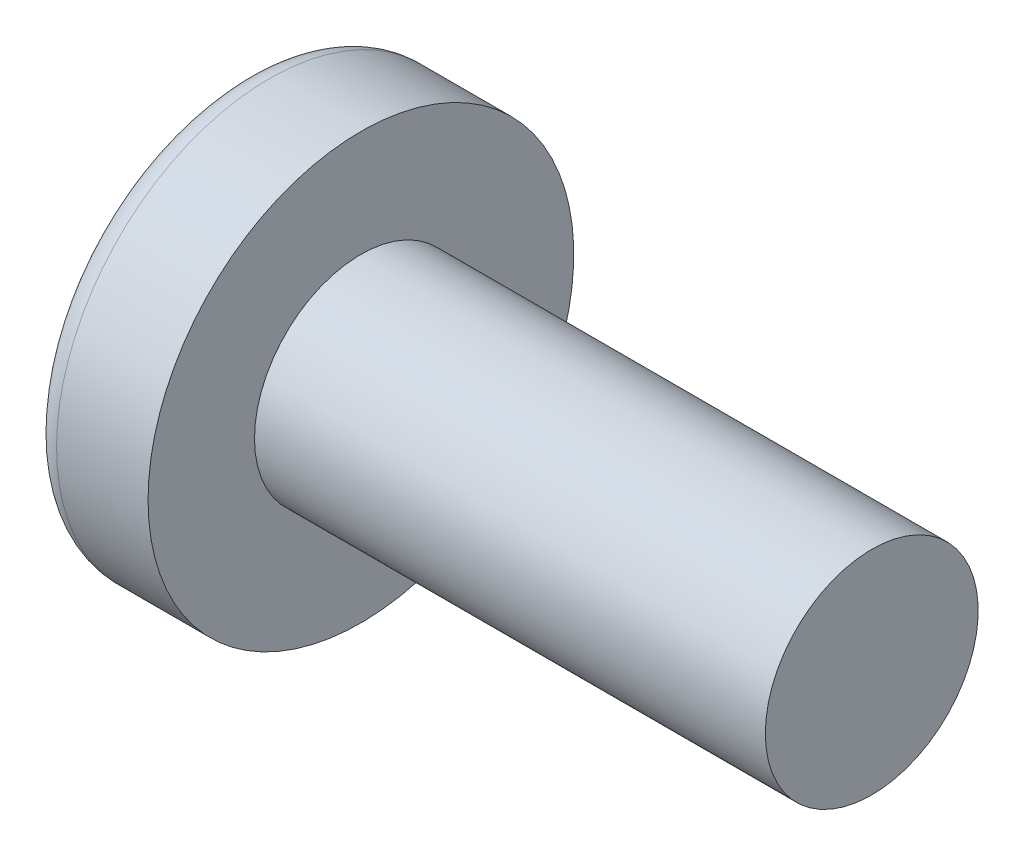
ISO-10303-21;
HEADER;
FILE_DESCRIPTION(('STEP AP214'),'2;1');
FILE_NAME('part.step','',(''),(''),'','','');
FILE_SCHEMA(('AUTOMOTIVE_DESIGN { 1 0 10303 214 1 1 1 1 }'));
ENDSEC;
DATA;
#1=APPLICATION_CONTEXT('core data for automotive mechanical design processes');
#2=APPLICATION_PROTOCOL_DEFINITION('international standard','automotive_design',2000,#1);
#3=PRODUCT_CONTEXT('',#1,'mechanical');
#4=PRODUCT('Part','Part','',(#3));
#5=PRODUCT_RELATED_PRODUCT_CATEGORY('part','',(#4));
#6=PRODUCT_DEFINITION_FORMATION('','',#4);
#7=PRODUCT_DEFINITION_CONTEXT('part definition',#1,'design');
#8=PRODUCT_DEFINITION('design','',#6,#7);
#9=PRODUCT_DEFINITION_SHAPE('','',#8);
#10=(LENGTH_UNIT() NAMED_UNIT(*) SI_UNIT(.MILLI.,.METRE.));
#11=(NAMED_UNIT(*) PLANE_ANGLE_UNIT() SI_UNIT($,.RADIAN.));
#12=(NAMED_UNIT(*) SI_UNIT($,.STERADIAN.) SOLID_ANGLE_UNIT());
#13=UNCERTAINTY_MEASURE_WITH_UNIT(LENGTH_MEASURE(1.E-05),#10,'distance_accuracy_value','');
#14=(GEOMETRIC_REPRESENTATION_CONTEXT(3) GLOBAL_UNCERTAINTY_ASSIGNED_CONTEXT((#13)) GLOBAL_UNIT_ASSIGNED_CONTEXT((#10,
#11,#12)) REPRESENTATION_CONTEXT('',''));
#15=CARTESIAN_POINT('',(0.,0.,0.));
#16=DIRECTION('',(0.,0.,1.));
#17=DIRECTION('',(1.,0.,0.));
#18=AXIS2_PLACEMENT_3D('',#15,#16,#17);
#19=CARTESIAN_POINT('',(1.53,0.175,-0.175));
#20=DIRECTION('',(-1.,0.,0.));
#21=DIRECTION('',(0.,0.,1.));
#22=AXIS2_PLACEMENT_3D('',#19,#20,#21);
#23=PLANE('',#22);
#24=DIRECTION('',(0.,1.,0.));
#25=VECTOR('',#24,1.);
#26=CARTESIAN_POINT('',(1.53,-0.175,0.175));
#27=LINE('',#26,#25);
#28=CARTESIAN_POINT('',(1.53000000000001,-0.175000000000024,0.17500000000007));
#29=VERTEX_POINT('',#28);
#30=CARTESIAN_POINT('',(1.53000000000001,0.175000000000047,0.175000000000024));
#31=VERTEX_POINT('',#30);
#32=EDGE_CURVE('E96',#29,#31,#27,.T.);
#33=ORIENTED_EDGE('',*,*,#32,.T.);
#34=DIRECTION('',(0.,0.,1.));
#35=VECTOR('',#34,1.);
#36=CARTESIAN_POINT('',(1.53,0.175,0.175));
#37=LINE('',#36,#35);
#38=CARTESIAN_POINT('',(1.53000000000001,0.175000000000023,-0.175000000000047));
#39=VERTEX_POINT('',#38);
#40=EDGE_CURVE('E179',#31,#39,#37,.F.);
#41=ORIENTED_EDGE('',*,*,#40,.T.);
#42=DIRECTION('',(0.,1.,0.));
#43=VECTOR('',#42,1.);
#44=CARTESIAN_POINT('',(1.53,0.175,-0.175));
#45=LINE('',#44,#43);
#46=CARTESIAN_POINT('',(1.53000000000001,-0.175000000000047,-0.175000000000024));
#47=VERTEX_POINT('',#46);
#48=EDGE_CURVE('E99',#39,#47,#45,.F.);
#49=ORIENTED_EDGE('',*,*,#48,.T.);
#50=DIRECTION('',(0.,0.,1.));
#51=VECTOR('',#50,1.);
#52=CARTESIAN_POINT('',(1.53,-0.175,-0.175));
#53=LINE('',#52,#51);
#54=EDGE_CURVE('E94',#47,#29,#53,.T.);
#55=ORIENTED_EDGE('',*,*,#54,.T.);
#56=EDGE_LOOP('',(#33,#41,#49,#55));
#57=FACE_BOUND('',#56,.T.);
#58=ADVANCED_FACE('F17',(#57),#23,.T.);
#59=CARTESIAN_POINT('',(1.53,0.175,-0.175));
#60=DIRECTION('',(0.605808178465619,0.,-0.795610740817499));
#61=DIRECTION('',(-0.795610740817499,0.,-0.605808178465619));
#62=AXIS2_PLACEMENT_3D('',#59,#60,#61);
#63=PLANE('',#62);
#64=ORIENTED_EDGE('',*,*,#48,.F.);
#65=DIRECTION('',(0.792336746135029,-0.0906267520091843,0.603315234802188));
#66=VECTOR('',#65,1.);
#67=CARTESIAN_POINT('',(0.195539940030044,0.327634320585383,-1.191108477036));
#68=LINE('',#67,#66);
#69=CARTESIAN_POINT('',(0.195539940029982,0.327634320585273,-1.19110847703603));
#70=VERTEX_POINT('',#69);
#71=EDGE_CURVE('E158',#70,#39,#68,.T.);
#72=ORIENTED_EDGE('',*,*,#71,.F.);
#73=CARTESIAN_POINT('',(0.19553994002992,-0.327634320585159,-1.19110847703605));
#74=CARTESIAN_POINT('',(0.18795976832639,-0.218422880390105,-1.19688030712404));
#75=CARTESIAN_POINT('',(0.184169682474625,-0.109211440195052,-1.19976622216803));
#76=CARTESIAN_POINT('',(0.184169682474625,0.109211440195056,-1.19976622216803));
#77=CARTESIAN_POINT('',(0.18795976832639,0.218422880390109,-1.19688030712404));
#78=CARTESIAN_POINT('',(0.195539940029921,0.327634320585163,-1.19110847703605));
#79=B_SPLINE_CURVE_WITH_KNOTS('',3,(#73,#74,#75,#76,#77,#78),.UNSPECIFIED.,.F.,.F.,(4,2,4),(0.,
0.327945860368665,0.65589172073733),.UNSPECIFIED.);
#80=CARTESIAN_POINT('',(0.195539940029981,-0.327634320585267,-1.19110847703603));
#81=VERTEX_POINT('',#80);
#82=EDGE_CURVE('E20',#81,#70,#79,.T.);
#83=ORIENTED_EDGE('',*,*,#82,.F.);
#84=DIRECTION('',(-0.79233674613503,-0.0906267520091801,-0.603315234802189));
#85=VECTOR('',#84,1.);
#86=CARTESIAN_POINT('',(1.53000000000001,-0.175000000000116,-0.175));
#87=LINE('',#86,#85);
#88=EDGE_CURVE('E163',#47,#81,#87,.T.);
#89=ORIENTED_EDGE('',*,*,#88,.F.);
#90=EDGE_LOOP('',(#64,#72,#83,#89));
#91=FACE_BOUND('',#90,.T.);
#92=ADVANCED_FACE('F301',(#91),#63,.F.);
#93=CARTESIAN_POINT('',(1.53,0.175,0.175));
#94=DIRECTION('',(0.605808178465619,0.795610740817499,0.));
#95=DIRECTION('',(-0.795610740817499,0.605808178465619,0.));
#96=AXIS2_PLACEMENT_3D('',#93,#94,#95);
#97=PLANE('',#96);
#98=ORIENTED_EDGE('',*,*,#40,.F.);
#99=DIRECTION('',(0.79233674613503,-0.603315234802189,-0.0906267520091823));
#100=VECTOR('',#99,1.);
#101=CARTESIAN_POINT('',(0.195539940030044,1.191108477036,0.327634320585379));
#102=LINE('',#101,#100);
#103=CARTESIAN_POINT('',(0.195539940029982,1.19110847703603,0.32763432058527));
#104=VERTEX_POINT('',#103);
#105=EDGE_CURVE('E143',#104,#31,#102,.T.);
#106=ORIENTED_EDGE('',*,*,#105,.F.);
#107=CARTESIAN_POINT('',(0.19553994002992,1.19110847703605,-0.327634320585162));
#108=CARTESIAN_POINT('',(0.187959768326372,1.19688030712378,-0.21842288039011));
#109=CARTESIAN_POINT('',(0.184169682474647,1.19976622216774,-0.109211440195056));
#110=CARTESIAN_POINT('',(0.184169682474842,1.19976622216812,0.109211440195063));
#111=CARTESIAN_POINT('',(0.187959768326763,1.19688030712455,0.218422880390129));
#112=CARTESIAN_POINT('',(0.195539940030506,1.1911084770372,0.327634320585196));
#113=B_SPLINE_CURVE_WITH_KNOTS('',3,(#107,#108,#109,#110,#111,#112),.UNSPECIFIED.,.F.,.F.,(4,2,
4),(0.,0.327945860368659,0.655891720737343),.UNSPECIFIED.);
#114=CARTESIAN_POINT('',(0.195539940029982,1.19110847703603,-0.32763432058527));
#115=VERTEX_POINT('',#114);
#116=EDGE_CURVE('E181',#115,#104,#113,.T.);
#117=ORIENTED_EDGE('',*,*,#116,.F.);
#118=DIRECTION('',(-0.79233674613503,0.603315234802189,-0.0906267520091823));
#119=VECTOR('',#118,1.);
#120=CARTESIAN_POINT('',(1.53000000000001,0.175,-0.175000000000117));
#121=LINE('',#120,#119);
#122=EDGE_CURVE('E148',#39,#115,#121,.T.);
#123=ORIENTED_EDGE('',*,*,#122,.F.);
#124=EDGE_LOOP('',(#98,#106,#117,#123));
#125=FACE_BOUND('',#124,.T.);
#126=ADVANCED_FACE('F298',(#125),#97,.F.);
#127=CARTESIAN_POINT('',(1.53,-0.175,0.175));
#128=DIRECTION('',(0.605808178465619,0.,0.795610740817499));
#129=DIRECTION('',(0.795610740817499,0.,-0.605808178465619));
#130=AXIS2_PLACEMENT_3D('',#127,#128,#129);
#131=PLANE('',#130);
#132=ORIENTED_EDGE('',*,*,#32,.F.);
#133=DIRECTION('',(0.792336746135029,0.0906267520091844,-0.603315234802188));
#134=VECTOR('',#133,1.);
#135=CARTESIAN_POINT('',(0.195539940030044,-0.327634320585383,1.191108477036));
#136=LINE('',#135,#134);
#137=CARTESIAN_POINT('',(0.195539940029982,-0.327634320585273,1.19110847703603));
#138=VERTEX_POINT('',#137);
#139=EDGE_CURVE('E107',#138,#29,#136,.T.);
#140=ORIENTED_EDGE('',*,*,#139,.F.);
#141=CARTESIAN_POINT('',(0.19553994002992,0.327634320585159,1.19110847703605));
#142=CARTESIAN_POINT('',(0.18795976832639,0.218422880390106,1.19688030712404));
#143=CARTESIAN_POINT('',(0.184169682474625,0.109211440195052,1.19976622216803));
#144=CARTESIAN_POINT('',(0.184169682474625,-0.109211440195055,1.19976622216803));
#145=CARTESIAN_POINT('',(0.18795976832639,-0.218422880390109,1.19688030712403));
#146=CARTESIAN_POINT('',(0.19553994002992,-0.327634320585162,1.19110847703605));
#147=B_SPLINE_CURVE_WITH_KNOTS('',3,(#141,#142,#143,#144,#145,#146),.UNSPECIFIED.,.F.,.F.,(4,2,
4),(0.,0.327945860368665,0.65589172073733),.UNSPECIFIED.);
#148=CARTESIAN_POINT('',(0.195539940029982,0.327634320585267,1.19110847703603));
#149=VERTEX_POINT('',#148);
#150=EDGE_CURVE('E112',#149,#138,#147,.T.);
#151=ORIENTED_EDGE('',*,*,#150,.F.);
#152=DIRECTION('',(-0.79233674613503,0.0906267520091802,0.603315234802189));
#153=VECTOR('',#152,1.);
#154=CARTESIAN_POINT('',(1.53000000000001,0.175000000000117,0.175));
#155=LINE('',#154,#153);
#156=EDGE_CURVE('E110',#31,#149,#155,.T.);
#157=ORIENTED_EDGE('',*,*,#156,.F.);
#158=EDGE_LOOP('',(#132,#140,#151,#157));
#159=FACE_BOUND('',#158,.T.);
#160=ADVANCED_FACE('F106',(#159),#131,.F.);
#161=CARTESIAN_POINT('',(1.53,-0.175,-0.175));
#162=DIRECTION('',(0.605808178465619,-0.795610740817499,0.));
#163=DIRECTION('',(0.795610740817499,0.605808178465619,0.));
#164=AXIS2_PLACEMENT_3D('',#161,#162,#163);
#165=PLANE('',#164);
#166=ORIENTED_EDGE('',*,*,#54,.F.);
#167=DIRECTION('',(0.79233674613503,0.603315234802189,0.0906267520091823));
#168=VECTOR('',#167,1.);
#169=CARTESIAN_POINT('',(0.195539940030044,-1.191108477036,-0.327634320585378));
#170=LINE('',#169,#168);
#171=CARTESIAN_POINT('',(0.195539940029982,-1.19110847703603,-0.32763432058527));
#172=VERTEX_POINT('',#171);
#173=EDGE_CURVE('E100',#172,#47,#170,.T.);
#174=ORIENTED_EDGE('',*,*,#173,.F.);
#175=CARTESIAN_POINT('',(0.19553994002992,-1.19110847703605,0.327634320585161));
#176=CARTESIAN_POINT('',(0.187959768326372,-1.19688030712378,0.218422880390109));
#177=CARTESIAN_POINT('',(0.184169682474647,-1.19976622216774,0.109211440195055));
#178=CARTESIAN_POINT('',(0.184169682474842,-1.19976622216812,-0.109211440195064));
#179=CARTESIAN_POINT('',(0.187959768326763,-1.19688030712455,-0.21842288039013));
#180=CARTESIAN_POINT('',(0.195539940030506,-1.1911084770372,-0.327634320585197));
#181=B_SPLINE_CURVE_WITH_KNOTS('',3,(#175,#176,#177,#178,#179,#180),.UNSPECIFIED.,.F.,.F.,(4,2,
4),(0.,0.327945860368659,0.655891720737343),.UNSPECIFIED.);
#182=CARTESIAN_POINT('',(0.195539940029982,-1.19110847703603,0.327634320585269));
#183=VERTEX_POINT('',#182);
#184=EDGE_CURVE('E40',#183,#172,#181,.T.);
#185=ORIENTED_EDGE('',*,*,#184,.F.);
#186=DIRECTION('',(-0.79233674613503,-0.603315234802189,0.0906267520091822));
#187=VECTOR('',#186,1.);
#188=CARTESIAN_POINT('',(1.53000000000001,-0.175,0.175000000000117));
#189=LINE('',#188,#187);
#190=EDGE_CURVE('E122',#29,#183,#189,.T.);
#191=ORIENTED_EDGE('',*,*,#190,.F.);
#192=EDGE_LOOP('',(#166,#174,#185,#191));
#193=FACE_BOUND('',#192,.T.);
#194=ADVANCED_FACE('F123',(#193),#165,.F.);
#195=CARTESIAN_POINT('',(1.75982832618,0.,-0.148712446352));
#196=DIRECTION('',(-0.113638160509999,0.,0.993522203312993));
#197=DIRECTION('',(0.993522203312993,0.,0.113638160509999));
#198=AXIS2_PLACEMENT_3D('',#195,#196,#197);
#199=PLANE('',#198);
#200=DIRECTION('',(0.987168682960103,0.112911450665712,0.112911450665468));
#201=VECTOR('',#200,1.);
#202=CARTESIAN_POINT('',(0.0301382525496957,-0.346552814251487,-0.346552814251));
#203=LINE('',#202,#201);
#204=CARTESIAN_POINT('',(0.0301382525497051,-0.346552814251486,-0.346552814251049));
#205=VERTEX_POINT('',#204);
#206=EDGE_CURVE('E74',#205,#47,#203,.T.);
#207=ORIENTED_EDGE('',*,*,#206,.F.);
#208=CARTESIAN_POINT('',(0.195539940029933,-1.19110847703603,-0.327634320585392));
#209=CARTESIAN_POINT('',(0.152876044928763,-1.0533445365469,-0.332514177868217));
#210=CARTESIAN_POINT('',(0.117760623421494,-0.914082927736931,-0.336530647648472));
#211=CARTESIAN_POINT('',(0.0626267275947612,-0.632564373475339,-0.342836812203841));
#212=CARTESIAN_POINT('',(0.0426082532752965,-0.490307428023714,-0.345126506978955));
#213=CARTESIAN_POINT('',(0.0301382525497336,-0.34655281425126,-0.346552814251499));
#214=B_SPLINE_CURVE_WITH_KNOTS('',3,(#208,#209,#210,#211,#212,#213),.UNSPECIFIED.,.F.,.F.,(4,2,
4),(0.,0.431030375854441,0.862060751708881),.UNSPECIFIED.);
#215=EDGE_CURVE('E126',#172,#205,#214,.T.);
#216=ORIENTED_EDGE('',*,*,#215,.F.);
#217=ORIENTED_EDGE('',*,*,#173,.T.);
#218=EDGE_LOOP('',(#207,#216,#217));
#219=FACE_BOUND('',#218,.T.);
#220=ADVANCED_FACE('F266',(#219),#199,.T.);
#221=CARTESIAN_POINT('',(1.75982832618,-0.148712446352,0.));
#222=DIRECTION('',(-0.113638160509999,0.993522203312993,0.));
#223=DIRECTION('',(-0.993522203312993,-0.113638160509999,0.));
#224=AXIS2_PLACEMENT_3D('',#221,#222,#223);
#225=PLANE('',#224);
#226=ORIENTED_EDGE('',*,*,#206,.T.);
#227=ORIENTED_EDGE('',*,*,#88,.T.);
#228=CARTESIAN_POINT('',(0.0301382525497145,-0.346552814251485,-0.346552814251098));
#229=CARTESIAN_POINT('',(0.0426082532752755,-0.345126506978949,-0.49030742802358));
#230=CARTESIAN_POINT('',(0.0626267275947409,-0.342836812203839,-0.632564373475233));
#231=CARTESIAN_POINT('',(0.11776062342148,-0.336530647648473,-0.914082927736879));
#232=CARTESIAN_POINT('',(0.152876044928754,-0.332514177868217,-1.05334453654687));
#233=CARTESIAN_POINT('',(0.195539940029933,-0.327634320585387,-1.19110847703603));
#234=B_SPLINE_CURVE_WITH_KNOTS('',3,(#228,#229,#230,#231,#232,#233),.UNSPECIFIED.,.F.,.F.,(4,2,
4),(0.,0.431030375854523,0.862060751709045),.UNSPECIFIED.);
#235=EDGE_CURVE('E270',#205,#81,#234,.T.);
#236=ORIENTED_EDGE('',*,*,#235,.F.);
#237=EDGE_LOOP('',(#226,#227,#236));
#238=FACE_BOUND('',#237,.T.);
#239=ADVANCED_FACE('F261',(#238),#225,.T.);
#240=CARTESIAN_POINT('',(1.75982832618,0.148712446352,0.));
#241=DIRECTION('',(-0.113638160509999,-0.993522203312993,0.));
#242=DIRECTION('',(0.993522203312993,-0.113638160509999,0.));
#243=AXIS2_PLACEMENT_3D('',#240,#241,#242);
#244=PLANE('',#243);
#245=ORIENTED_EDGE('',*,*,#71,.T.);
#246=DIRECTION('',(0.987168682960103,-0.112911450665468,0.112911450665712));
#247=VECTOR('',#246,1.);
#248=CARTESIAN_POINT('',(0.0301382525496959,0.346552814251,-0.346552814251488));
#249=LINE('',#248,#247);
#250=CARTESIAN_POINT('',(0.0301382525497061,0.346552814251049,-0.346552814251488));
#251=VERTEX_POINT('',#250);
#252=EDGE_CURVE('E153',#251,#39,#249,.T.);
#253=ORIENTED_EDGE('',*,*,#252,.F.);
#254=CARTESIAN_POINT('',(0.195539940029933,0.327634320585395,-1.19110847703603));
#255=CARTESIAN_POINT('',(0.15287604492876,0.332514177868223,-1.05334453654689));
#256=CARTESIAN_POINT('',(0.117760623421489,0.336530647648478,-0.91408292773691));
#257=CARTESIAN_POINT('',(0.0626267275947526,0.342836812203842,-0.632564373475297));
#258=CARTESIAN_POINT('',(0.0426082532752867,0.345126506978951,-0.490307428023661));
#259=CARTESIAN_POINT('',(0.0301382525497232,0.346552814251487,-0.346552814251195));
#260=B_SPLINE_CURVE_WITH_KNOTS('',3,(#254,#255,#256,#257,#258,#259),.UNSPECIFIED.,.F.,.F.,(4,2,
4),(0.,0.431030375854474,0.862060751708948),.UNSPECIFIED.);
#261=EDGE_CURVE('E246',#70,#251,#260,.T.);
#262=ORIENTED_EDGE('',*,*,#261,.F.);
#263=EDGE_LOOP('',(#245,#253,#262));
#264=FACE_BOUND('',#263,.T.);
#265=ADVANCED_FACE('F256',(#264),#244,.T.);
#266=CARTESIAN_POINT('',(1.75982832618,0.,-0.148712446352));
#267=DIRECTION('',(-0.113638160509999,0.,0.993522203312993));
#268=DIRECTION('',(0.993522203312993,0.,0.113638160509999));
#269=AXIS2_PLACEMENT_3D('',#266,#267,#268);
#270=PLANE('',#269);
#271=ORIENTED_EDGE('',*,*,#252,.T.);
#272=ORIENTED_EDGE('',*,*,#122,.T.);
#273=CARTESIAN_POINT('',(0.0301382525497163,0.346552814251097,-0.346552814251487));
#274=CARTESIAN_POINT('',(0.0426082532752764,0.49030742802358,-0.345126506978951));
#275=CARTESIAN_POINT('',(0.0626267275947411,0.632564373475233,-0.342836812203842));
#276=CARTESIAN_POINT('',(0.11776062342148,0.914082927736878,-0.336530647648476));
#277=CARTESIAN_POINT('',(0.152876044928754,1.05334453654687,-0.33251417786822));
#278=CARTESIAN_POINT('',(0.195539940029933,1.19110847703603,-0.32763432058539));
#279=B_SPLINE_CURVE_WITH_KNOTS('',3,(#273,#274,#275,#276,#277,#278),.UNSPECIFIED.,.F.,.F.,(4,2,
4),(0.,0.431030375854522,0.862060751709044),.UNSPECIFIED.);
#280=EDGE_CURVE('E239',#251,#115,#279,.T.);
#281=ORIENTED_EDGE('',*,*,#280,.F.);
#282=EDGE_LOOP('',(#271,#272,#281));
#283=FACE_BOUND('',#282,.T.);
#284=ADVANCED_FACE('F253',(#283),#270,.T.);
#285=CARTESIAN_POINT('',(1.75982832618,0.,0.148712446352));
#286=DIRECTION('',(-0.113638160509999,0.,-0.993522203312993));
#287=DIRECTION('',(-0.993522203312993,0.,0.113638160509999));
#288=AXIS2_PLACEMENT_3D('',#285,#286,#287);
#289=PLANE('',#288);
#290=DIRECTION('',(0.987168682960103,-0.112911450665712,-0.112911450665468));
#291=VECTOR('',#290,1.);
#292=CARTESIAN_POINT('',(0.0301382525496957,0.346552814251487,0.346552814251));
#293=LINE('',#292,#291);
#294=CARTESIAN_POINT('',(0.0301382525497051,0.346552814251486,0.346552814251048));
#295=VERTEX_POINT('',#294);
#296=EDGE_CURVE('E139',#295,#31,#293,.T.);
#297=ORIENTED_EDGE('',*,*,#296,.F.);
#298=CARTESIAN_POINT('',(0.195539940029933,1.19110847703603,0.327634320585391));
#299=CARTESIAN_POINT('',(0.152876044928762,1.0533445365469,0.332514177868217));
#300=CARTESIAN_POINT('',(0.117760623421493,0.914082927736931,0.336530647648472));
#301=CARTESIAN_POINT('',(0.0626267275947594,0.632564373475339,0.342836812203842));
#302=CARTESIAN_POINT('',(0.0426082532752946,0.490307428023714,0.345126506978956));
#303=CARTESIAN_POINT('',(0.0301382525497319,0.346552814251259,0.3465528142515));
#304=B_SPLINE_CURVE_WITH_KNOTS('',3,(#298,#299,#300,#301,#302,#303),.UNSPECIFIED.,.F.,.F.,(4,2,
4),(0.,0.431030375854441,0.862060751708882),.UNSPECIFIED.);
#305=EDGE_CURVE('E232',#104,#295,#304,.T.);
#306=ORIENTED_EDGE('',*,*,#305,.F.);
#307=ORIENTED_EDGE('',*,*,#105,.T.);
#308=EDGE_LOOP('',(#297,#306,#307));
#309=FACE_BOUND('',#308,.T.);
#310=ADVANCED_FACE('F221',(#309),#289,.T.);
#311=CARTESIAN_POINT('',(1.75982832618,0.148712446352,0.));
#312=DIRECTION('',(-0.113638160509999,-0.993522203312993,0.));
#313=DIRECTION('',(0.993522203312993,-0.113638160509999,0.));
#314=AXIS2_PLACEMENT_3D('',#311,#312,#313);
#315=PLANE('',#314);
#316=ORIENTED_EDGE('',*,*,#296,.T.);
#317=ORIENTED_EDGE('',*,*,#156,.T.);
#318=CARTESIAN_POINT('',(0.0301382525497145,0.346552814251485,0.346552814251097));
#319=CARTESIAN_POINT('',(0.0426082532752754,0.345126506978949,0.490307428023579));
#320=CARTESIAN_POINT('',(0.0626267275947407,0.342836812203839,0.632564373475232));
#321=CARTESIAN_POINT('',(0.11776062342148,0.336530647648473,0.914082927736878));
#322=CARTESIAN_POINT('',(0.152876044928754,0.332514177868217,1.05334453654687));
#323=CARTESIAN_POINT('',(0.195539940029933,0.327634320585387,1.19110847703603));
#324=B_SPLINE_CURVE_WITH_KNOTS('',3,(#318,#319,#320,#321,#322,#323),.UNSPECIFIED.,.F.,.F.,(4,2,
4),(0.,0.431030375854522,0.862060751709045),.UNSPECIFIED.);
#325=EDGE_CURVE('E225',#295,#149,#324,.T.);
#326=ORIENTED_EDGE('',*,*,#325,.F.);
#327=EDGE_LOOP('',(#316,#317,#326));
#328=FACE_BOUND('',#327,.T.);
#329=ADVANCED_FACE('F217',(#328),#315,.T.);
#330=CARTESIAN_POINT('',(1.75982832618,-0.148712446352,0.));
#331=DIRECTION('',(-0.113638160509999,0.993522203312993,0.));
#332=DIRECTION('',(-0.993522203312993,-0.113638160509999,0.));
#333=AXIS2_PLACEMENT_3D('',#330,#331,#332);
#334=PLANE('',#333);
#335=ORIENTED_EDGE('',*,*,#139,.T.);
#336=DIRECTION('',(0.987168682960103,0.112911450665468,-0.112911450665712));
#337=VECTOR('',#336,1.);
#338=CARTESIAN_POINT('',(0.0301382525496959,-0.346552814251,0.346552814251488));
#339=LINE('',#338,#337);
#340=CARTESIAN_POINT('',(0.030138252549706,-0.346552814251049,0.346552814251487));
#341=VERTEX_POINT('',#340);
#342=EDGE_CURVE('E117',#341,#29,#339,.T.);
#343=ORIENTED_EDGE('',*,*,#342,.F.);
#344=CARTESIAN_POINT('',(0.195539940029933,-0.327634320585395,1.19110847703603));
#345=CARTESIAN_POINT('',(0.152876044928759,-0.332514177868224,1.05334453654689));
#346=CARTESIAN_POINT('',(0.117760623421488,-0.336530647648479,0.914082927736909));
#347=CARTESIAN_POINT('',(0.0626267275947518,-0.342836812203842,0.632564373475296));
#348=CARTESIAN_POINT('',(0.0426082532752862,-0.345126506978951,0.49030742802366));
#349=CARTESIAN_POINT('',(0.0301382525497232,-0.346552814251486,0.346552814251194));
#350=B_SPLINE_CURVE_WITH_KNOTS('',3,(#344,#345,#346,#347,#348,#349),.UNSPECIFIED.,.F.,.F.,(4,2,
4),(0.,0.431030375854474,0.862060751708948),.UNSPECIFIED.);
#351=EDGE_CURVE('E120',#138,#341,#350,.T.);
#352=ORIENTED_EDGE('',*,*,#351,.F.);
#353=EDGE_LOOP('',(#335,#343,#352));
#354=FACE_BOUND('',#353,.T.);
#355=ADVANCED_FACE('F115',(#354),#334,.T.);
#356=CARTESIAN_POINT('',(1.75982832618,0.,0.148712446352));
#357=DIRECTION('',(-0.113638160509999,0.,-0.993522203312993));
#358=DIRECTION('',(-0.993522203312993,0.,0.113638160509999));
#359=AXIS2_PLACEMENT_3D('',#356,#357,#358);
#360=PLANE('',#359);
#361=ORIENTED_EDGE('',*,*,#342,.T.);
#362=ORIENTED_EDGE('',*,*,#190,.T.);
#363=CARTESIAN_POINT('',(0.0301382525497162,-0.346552814251097,0.346552814251485));
#364=CARTESIAN_POINT('',(0.0426082532752764,-0.49030742802358,0.34512650697895));
#365=CARTESIAN_POINT('',(0.0626267275947412,-0.632564373475232,0.342836812203841));
#366=CARTESIAN_POINT('',(0.11776062342148,-0.914082927736878,0.336530647648476));
#367=CARTESIAN_POINT('',(0.152876044928754,-1.05334453654687,0.33251417786822));
#368=CARTESIAN_POINT('',(0.195539940029933,-1.19110847703603,0.327634320585391));
#369=B_SPLINE_CURVE_WITH_KNOTS('',3,(#363,#364,#365,#366,#367,#368),.UNSPECIFIED.,.F.,.F.,(4,2,
4),(0.,0.431030375854522,0.862060751709045),.UNSPECIFIED.);
#370=EDGE_CURVE('E129',#341,#183,#369,.T.);
#371=ORIENTED_EDGE('',*,*,#370,.F.);
#372=EDGE_LOOP('',(#361,#362,#371));
#373=FACE_BOUND('',#372,.T.);
#374=ADVANCED_FACE('F128',(#373),#360,.T.);
#375=CARTESIAN_POINT('',(4.,0.,0.));
#376=DIRECTION('',(0.,1.,0.));
#377=DIRECTION('',(1.,0.,0.));
#378=AXIS2_PLACEMENT_3D('',#375,#376,#377);
#379=SPHERICAL_SURFACE('',#378,4.);
#380=CARTESIAN_POINT('',(0.78389734472545,0.,0.));
#381=DIRECTION('',(-1.,0.,0.));
#382=DIRECTION('',(0.,0.,1.));
#383=AXIS2_PLACEMENT_3D('',#380,#381,#382);
#384=CIRCLE('',#383,2.37837837837841);
#385=CARTESIAN_POINT('',(0.78389734472545,0.,2.37837837837841));
#386=VERTEX_POINT('',#385);
#387=EDGE_CURVE('E193',#386,#386,#384,.F.);
#388=ORIENTED_EDGE('',*,*,#387,.F.);
#389=EDGE_LOOP('',(#388));
#390=FACE_BOUND('',#389,.T.);
#391=ORIENTED_EDGE('',*,*,#370,.T.);
#392=ORIENTED_EDGE('',*,*,#184,.T.);
#393=ORIENTED_EDGE('',*,*,#215,.T.);
#394=ORIENTED_EDGE('',*,*,#235,.T.);
#395=ORIENTED_EDGE('',*,*,#82,.T.);
#396=ORIENTED_EDGE('',*,*,#261,.T.);
#397=ORIENTED_EDGE('',*,*,#280,.T.);
#398=ORIENTED_EDGE('',*,*,#116,.T.);
#399=ORIENTED_EDGE('',*,*,#305,.T.);
#400=ORIENTED_EDGE('',*,*,#325,.T.);
#401=ORIENTED_EDGE('',*,*,#150,.T.);
#402=ORIENTED_EDGE('',*,*,#351,.T.);
#403=EDGE_LOOP('',(#391,#392,#393,#394,#395,#396,#397,#398,#399,#400,#401,#402));
#404=FACE_BOUND('',#403,.T.);
#405=ADVANCED_FACE('F208',(#390,#404),#379,.T.);
#406=CARTESIAN_POINT('',(1.025105043871,0.,0.));
#407=DIRECTION('',(-1.,0.,0.));
#408=DIRECTION('',(0.,0.,1.));
#409=AXIS2_PLACEMENT_3D('',#406,#407,#408);
#410=TOROIDAL_SURFACE('',#409,2.2,0.3);
#411=ORIENTED_EDGE('',*,*,#387,.T.);
#412=EDGE_LOOP('',(#411));
#413=FACE_BOUND('',#412,.T.);
#414=CARTESIAN_POINT('',(1.025105043871,0.,0.));
#415=DIRECTION('',(-1.,0.,0.));
#416=DIRECTION('',(0.,0.,1.));
#417=AXIS2_PLACEMENT_3D('',#414,#415,#416);
#418=CIRCLE('',#417,2.5);
#419=CARTESIAN_POINT('',(1.025105043871,0.,2.5));
#420=VERTEX_POINT('',#419);
#421=EDGE_CURVE('E192',#420,#420,#418,.F.);
#422=ORIENTED_EDGE('',*,*,#421,.F.);
#423=EDGE_LOOP('',(#422));
#424=FACE_BOUND('',#423,.T.);
#425=ADVANCED_FACE('F338',(#413,#424),#410,.T.);
#426=CARTESIAN_POINT('',(-25.4,0.,0.));
#427=DIRECTION('',(-1.,0.,0.));
#428=DIRECTION('',(0.,0.,1.));
#429=AXIS2_PLACEMENT_3D('',#426,#427,#428);
#430=CYLINDRICAL_SURFACE('',#429,2.5);
#431=ORIENTED_EDGE('',*,*,#421,.T.);
#432=EDGE_LOOP('',(#431));
#433=FACE_BOUND('',#432,.T.);
#434=CARTESIAN_POINT('',(2.1,0.,0.));
#435=DIRECTION('',(-1.,0.,0.));
#436=DIRECTION('',(0.,0.,1.));
#437=AXIS2_PLACEMENT_3D('',#434,#435,#436);
#438=CIRCLE('',#437,2.5);
#439=CARTESIAN_POINT('',(2.1,0.,2.5));
#440=VERTEX_POINT('',#439);
#441=EDGE_CURVE('E189',#440,#440,#438,.T.);
#442=ORIENTED_EDGE('',*,*,#441,.T.);
#443=EDGE_LOOP('',(#442));
#444=FACE_BOUND('',#443,.T.);
#445=ADVANCED_FACE('F335',(#433,#444),#430,.T.);
#446=CARTESIAN_POINT('',(8.1,1.25,0.));
#447=DIRECTION('',(1.,0.,0.));
#448=DIRECTION('',(0.,0.,-1.));
#449=AXIS2_PLACEMENT_3D('',#446,#447,#448);
#450=PLANE('',#449);
#451=CARTESIAN_POINT('',(8.1,0.,0.));
#452=DIRECTION('',(-1.,0.,0.));
#453=DIRECTION('',(0.,0.,1.));
#454=AXIS2_PLACEMENT_3D('',#451,#452,#453);
#455=CIRCLE('',#454,1.25);
#456=CARTESIAN_POINT('',(8.1,0.,1.25));
#457=VERTEX_POINT('',#456);
#458=EDGE_CURVE('E31',#457,#457,#455,.T.);
#459=ORIENTED_EDGE('',*,*,#458,.F.);
#460=EDGE_LOOP('',(#459));
#461=FACE_BOUND('',#460,.T.);
#462=ADVANCED_FACE('F328',(#461),#450,.T.);
#463=CARTESIAN_POINT('',(2.1,1.25,0.));
#464=DIRECTION('',(-1.,0.,0.));
#465=DIRECTION('',(0.,0.,1.));
#466=AXIS2_PLACEMENT_3D('',#463,#464,#465);
#467=PLANE('',#466);
#468=CARTESIAN_POINT('',(2.1,0.,0.));
#469=DIRECTION('',(-1.,0.,0.));
#470=DIRECTION('',(0.,0.,1.));
#471=AXIS2_PLACEMENT_3D('',#468,#469,#470);
#472=CIRCLE('',#471,1.25);
#473=CARTESIAN_POINT('',(2.1,0.,1.25));
#474=VERTEX_POINT('',#473);
#475=EDGE_CURVE('E11',#474,#474,#472,.F.);
#476=ORIENTED_EDGE('',*,*,#475,.F.);
#477=EDGE_LOOP('',(#476));
#478=FACE_BOUND('',#477,.T.);
#479=ORIENTED_EDGE('',*,*,#441,.F.);
#480=EDGE_LOOP('',(#479));
#481=FACE_BOUND('',#480,.T.);
#482=ADVANCED_FACE('F322',(#478,#481),#467,.F.);
#483=CARTESIAN_POINT('',(-25.4,0.,0.));
#484=DIRECTION('',(-1.,0.,0.));
#485=DIRECTION('',(0.,0.,1.));
#486=AXIS2_PLACEMENT_3D('',#483,#484,#485);
#487=CYLINDRICAL_SURFACE('',#486,1.25);
#488=ORIENTED_EDGE('',*,*,#475,.T.);
#489=EDGE_LOOP('',(#488));
#490=FACE_BOUND('',#489,.T.);
#491=ORIENTED_EDGE('',*,*,#458,.T.);
#492=EDGE_LOOP('',(#491));
#493=FACE_BOUND('',#492,.T.);
#494=ADVANCED_FACE('F320',(#490,#493),#487,.T.);
#495=CLOSED_SHELL('',(#58,#92,#126,#160,#194,#220,#239,#265,#284,#310,#329,#355,#374,#405,#425,
#445,#462,#482,#494));
#496=MANIFOLD_SOLID_BREP('B1',#495);
#497=ADVANCED_BREP_SHAPE_REPRESENTATION('',(#18,#496),#14);
#498=SHAPE_DEFINITION_REPRESENTATION(#9,#497);
ENDSEC;
END-ISO-10303-21;
